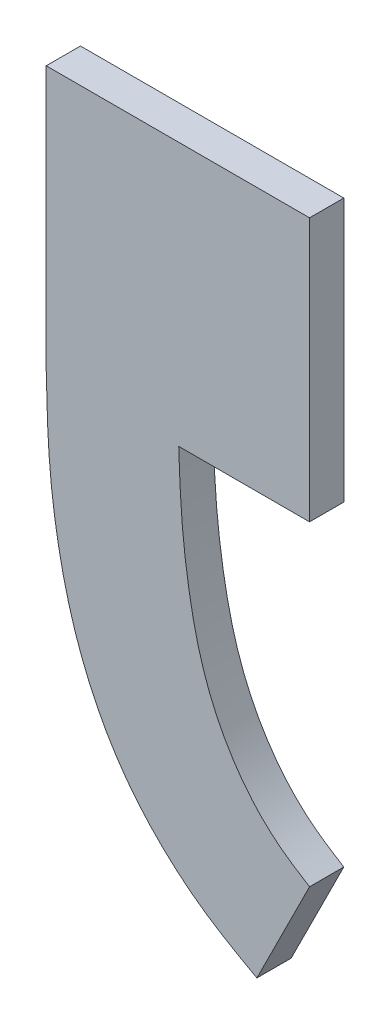
ISO-10303-21;
HEADER;
FILE_DESCRIPTION(('STEP AP214'),'2;1');
FILE_NAME('part.step','',(''),(''),'','','');
FILE_SCHEMA(('AUTOMOTIVE_DESIGN { 1 0 10303 214 1 1 1 1 }'));
ENDSEC;
DATA;
#1=APPLICATION_CONTEXT('core data for automotive mechanical design processes');
#2=APPLICATION_PROTOCOL_DEFINITION('international standard','automotive_design',2000,#1);
#3=PRODUCT_CONTEXT('',#1,'mechanical');
#4=PRODUCT('Part','Part','',(#3));
#5=PRODUCT_RELATED_PRODUCT_CATEGORY('part','',(#4));
#6=PRODUCT_DEFINITION_FORMATION('','',#4);
#7=PRODUCT_DEFINITION_CONTEXT('part definition',#1,'design');
#8=PRODUCT_DEFINITION('design','',#6,#7);
#9=PRODUCT_DEFINITION_SHAPE('','',#8);
#10=(LENGTH_UNIT() NAMED_UNIT(*) SI_UNIT(.MILLI.,.METRE.));
#11=(NAMED_UNIT(*) PLANE_ANGLE_UNIT() SI_UNIT($,.RADIAN.));
#12=(NAMED_UNIT(*) SI_UNIT($,.STERADIAN.) SOLID_ANGLE_UNIT());
#13=UNCERTAINTY_MEASURE_WITH_UNIT(LENGTH_MEASURE(1.E-05),#10,'distance_accuracy_value','');
#14=(GEOMETRIC_REPRESENTATION_CONTEXT(3) GLOBAL_UNCERTAINTY_ASSIGNED_CONTEXT((#13)) GLOBAL_UNIT_ASSIGNED_CONTEXT((#10,
#11,#12)) REPRESENTATION_CONTEXT('',''));
#15=CARTESIAN_POINT('',(0.,0.,0.));
#16=DIRECTION('',(0.,0.,1.));
#17=DIRECTION('',(1.,0.,0.));
#18=AXIS2_PLACEMENT_3D('',#15,#16,#17);
#19=CARTESIAN_POINT('',(0.0120192307692477,-15.,0.5));
#20=DIRECTION('',(0.,1.,0.));
#21=DIRECTION('',(0.,0.,1.));
#22=AXIS2_PLACEMENT_3D('',#19,#20,#21);
#23=PLANE('',#22);
#24=DIRECTION('',(1.,0.,0.));
#25=VECTOR('',#24,1.);
#26=CARTESIAN_POINT('',(0.0120192307692477,-15.,0.));
#27=LINE('',#26,#25);
#28=CARTESIAN_POINT('',(0.0120192307692477,-15.,0.));
#29=VERTEX_POINT('',#28);
#30=CARTESIAN_POINT('',(1.92307692307694,-15.,0.));
#31=VERTEX_POINT('',#30);
#32=EDGE_CURVE('E134',#29,#31,#27,.T.);
#33=ORIENTED_EDGE('',*,*,#32,.T.);
#34=DIRECTION('',(0.,0.,-1.));
#35=VECTOR('',#34,1.);
#36=CARTESIAN_POINT('',(1.92307692307694,-15.,0.5));
#37=LINE('',#36,#35);
#38=CARTESIAN_POINT('',(1.92307692307694,-15.,0.5));
#39=VERTEX_POINT('',#38);
#40=EDGE_CURVE('E11',#39,#31,#37,.T.);
#41=ORIENTED_EDGE('',*,*,#40,.F.);
#42=DIRECTION('',(1.,0.,0.));
#43=VECTOR('',#42,1.);
#44=CARTESIAN_POINT('',(0.0120192307692477,-15.,0.5));
#45=LINE('',#44,#43);
#46=CARTESIAN_POINT('',(0.0120192307692477,-15.,0.5));
#47=VERTEX_POINT('',#46);
#48=EDGE_CURVE('E194',#47,#39,#45,.T.);
#49=ORIENTED_EDGE('',*,*,#48,.F.);
#50=DIRECTION('',(0.,0.,-1.));
#51=VECTOR('',#50,1.);
#52=CARTESIAN_POINT('',(0.0120192307692477,-15.,0.5));
#53=LINE('',#52,#51);
#54=EDGE_CURVE('E124',#47,#29,#53,.T.);
#55=ORIENTED_EDGE('',*,*,#54,.T.);
#56=EDGE_LOOP('',(#33,#41,#49,#55));
#57=FACE_BOUND('',#56,.T.);
#58=ADVANCED_FACE('F39',(#57),#23,.F.);
#59=CARTESIAN_POINT('',(1.92307692307694,-15.,0.5));
#60=DIRECTION('',(-1.,0.,0.));
#61=DIRECTION('',(0.,0.,1.));
#62=AXIS2_PLACEMENT_3D('',#59,#60,#61);
#63=PLANE('',#62);
#64=DIRECTION('',(0.,1.,0.));
#65=VECTOR('',#64,1.);
#66=CARTESIAN_POINT('',(1.92307692307694,-15.,0.));
#67=LINE('',#66,#65);
#68=CARTESIAN_POINT('',(1.92307692307694,-11.1538461538462,0.));
#69=VERTEX_POINT('',#68);
#70=EDGE_CURVE('E163',#31,#69,#67,.T.);
#71=ORIENTED_EDGE('',*,*,#70,.T.);
#72=DIRECTION('',(0.,0.,-1.));
#73=VECTOR('',#72,1.);
#74=CARTESIAN_POINT('',(1.92307692307694,-11.1538461538462,0.5));
#75=LINE('',#74,#73);
#76=CARTESIAN_POINT('',(1.92307692307694,-11.1538461538462,0.5));
#77=VERTEX_POINT('',#76);
#78=EDGE_CURVE('E50',#77,#69,#75,.T.);
#79=ORIENTED_EDGE('',*,*,#78,.F.);
#80=DIRECTION('',(0.,1.,0.));
#81=VECTOR('',#80,1.);
#82=CARTESIAN_POINT('',(1.92307692307694,-15.,0.5));
#83=LINE('',#82,#81);
#84=EDGE_CURVE('E94',#39,#77,#83,.T.);
#85=ORIENTED_EDGE('',*,*,#84,.F.);
#86=ORIENTED_EDGE('',*,*,#40,.T.);
#87=EDGE_LOOP('',(#71,#79,#85,#86));
#88=FACE_BOUND('',#87,.T.);
#89=ADVANCED_FACE('F160',(#88),#63,.F.);
#90=CARTESIAN_POINT('',(1.92307692307694,-11.1538461538462,0.5));
#91=DIRECTION('',(0.,-1.,0.));
#92=DIRECTION('',(0.,0.,-1.));
#93=AXIS2_PLACEMENT_3D('',#90,#91,#92);
#94=PLANE('',#93);
#95=DIRECTION('',(-1.,0.,0.));
#96=VECTOR('',#95,1.);
#97=CARTESIAN_POINT('',(1.92307692307694,-11.1538461538462,0.));
#98=LINE('',#97,#96);
#99=CARTESIAN_POINT('',(-1.92307692307691,-11.1538461538462,0.));
#100=VERTEX_POINT('',#99);
#101=EDGE_CURVE('E171',#69,#100,#98,.T.);
#102=ORIENTED_EDGE('',*,*,#101,.T.);
#103=DIRECTION('',(0.,0.,-1.));
#104=VECTOR('',#103,1.);
#105=CARTESIAN_POINT('',(-1.92307692307691,-11.1538461538462,0.5));
#106=LINE('',#105,#104);
#107=CARTESIAN_POINT('',(-1.92307692307691,-11.1538461538462,0.5));
#108=VERTEX_POINT('',#107);
#109=EDGE_CURVE('E180',#108,#100,#106,.T.);
#110=ORIENTED_EDGE('',*,*,#109,.F.);
#111=DIRECTION('',(-1.,0.,0.));
#112=VECTOR('',#111,1.);
#113=CARTESIAN_POINT('',(1.92307692307694,-11.1538461538462,0.5));
#114=LINE('',#113,#112);
#115=EDGE_CURVE('E176',#77,#108,#114,.T.);
#116=ORIENTED_EDGE('',*,*,#115,.F.);
#117=ORIENTED_EDGE('',*,*,#78,.T.);
#118=EDGE_LOOP('',(#102,#110,#116,#117));
#119=FACE_BOUND('',#118,.T.);
#120=ADVANCED_FACE('F151',(#119),#94,.F.);
#121=CARTESIAN_POINT('',(-1.92307692307691,-11.1538461538462,0.5));
#122=DIRECTION('',(1.,0.,0.));
#123=DIRECTION('',(0.,0.,-1.));
#124=AXIS2_PLACEMENT_3D('',#121,#122,#123);
#125=PLANE('',#124);
#126=DIRECTION('',(0.,-1.,0.));
#127=VECTOR('',#126,1.);
#128=CARTESIAN_POINT('',(-1.92307692307691,-11.1538461538462,0.));
#129=LINE('',#128,#127);
#130=CARTESIAN_POINT('',(-1.92307692307691,-15.,0.));
#131=VERTEX_POINT('',#130);
#132=EDGE_CURVE('E177',#100,#131,#129,.T.);
#133=ORIENTED_EDGE('',*,*,#132,.T.);
#134=DIRECTION('',(0.,0.,-1.));
#135=VECTOR('',#134,1.);
#136=CARTESIAN_POINT('',(-1.92307692307691,-15.,0.5));
#137=LINE('',#136,#135);
#138=CARTESIAN_POINT('',(-1.92307692307691,-15.,0.5));
#139=VERTEX_POINT('',#138);
#140=EDGE_CURVE('E118',#139,#131,#137,.T.);
#141=ORIENTED_EDGE('',*,*,#140,.F.);
#142=DIRECTION('',(0.,-1.,0.));
#143=VECTOR('',#142,1.);
#144=CARTESIAN_POINT('',(-1.92307692307691,-11.1538461538462,0.5));
#145=LINE('',#144,#143);
#146=EDGE_CURVE('E112',#108,#139,#145,.T.);
#147=ORIENTED_EDGE('',*,*,#146,.F.);
#148=ORIENTED_EDGE('',*,*,#109,.T.);
#149=EDGE_LOOP('',(#133,#141,#147,#148));
#150=FACE_BOUND('',#149,.T.);
#151=ADVANCED_FACE('F152',(#150),#125,.F.);
#152=CARTESIAN_POINT('',(-1.92307692307691,-15.,0.5));
#153=CARTESIAN_POINT('',(-1.91433657056015,-15.3810767358832,0.5));
#154=CARTESIAN_POINT('',(-1.89766609116232,-16.1079046140902,0.5));
#155=CARTESIAN_POINT('',(-1.76020005937377,-17.1394582093312,0.5));
#156=CARTESIAN_POINT('',(-1.536476701543,-18.0601395414614,0.5));
#157=CARTESIAN_POINT('',(-1.21069108944097,-18.8711982332195,0.5));
#158=CARTESIAN_POINT('',(-0.785119946019379,-19.5855678421094,0.5));
#159=CARTESIAN_POINT('',(-0.242975559569955,-20.2021133103051,0.5));
#160=CARTESIAN_POINT('',(0.40399486861272,-20.737784557651,0.5));
#161=CARTESIAN_POINT('',(0.900466251360351,-21.0132560811903,0.5));
#162=CARTESIAN_POINT('',(1.15384615384617,-21.1538461538462,0.5));
#163=B_SPLINE_CURVE_WITH_KNOTS('',3,(#152,#153,#154,#155,#156,#157,#158,#159,#160,#161,#162),
.UNSPECIFIED.,.F.,.F.,(4,1,1,1,1,1,1,1,4),(0.,0.156601585827271,0.298686294997552,
0.426910206074715,0.545117488967752,0.656687364828344,0.767001116976198,0.881086329823996,1.),.UNSPECIFIED.);
#164=DIRECTION('',(0.,0.,-1.));
#165=VECTOR('',#164,1.);
#166=SURFACE_OF_LINEAR_EXTRUSION('',#163,#165);
#167=CARTESIAN_POINT('',(-1.92307692307691,-15.,0.));
#168=CARTESIAN_POINT('',(-1.91433657056015,-15.3810767358832,0.));
#169=CARTESIAN_POINT('',(-1.89766609116232,-16.1079046140902,0.));
#170=CARTESIAN_POINT('',(-1.76020005937377,-17.1394582093312,0.));
#171=CARTESIAN_POINT('',(-1.536476701543,-18.0601395414614,0.));
#172=CARTESIAN_POINT('',(-1.21069108944097,-18.8711982332195,0.));
#173=CARTESIAN_POINT('',(-0.785119946019379,-19.5855678421094,0.));
#174=CARTESIAN_POINT('',(-0.242975559569955,-20.2021133103051,0.));
#175=CARTESIAN_POINT('',(0.40399486861272,-20.737784557651,0.));
#176=CARTESIAN_POINT('',(0.900466251360351,-21.0132560811903,0.));
#177=CARTESIAN_POINT('',(1.15384615384617,-21.1538461538462,0.));
#178=B_SPLINE_CURVE_WITH_KNOTS('',3,(#167,#168,#169,#170,#171,#172,#173,#174,#175,#176,#177),
.UNSPECIFIED.,.F.,.F.,(4,1,1,1,1,1,1,1,4),(0.,0.156601585827271,0.298686294997552,
0.426910206074715,0.545117488967752,0.656687364828344,0.767001116976198,0.881086329823996,1.),.UNSPECIFIED.);
#179=CARTESIAN_POINT('',(1.15384615384617,-21.1538461538462,0.));
#180=VERTEX_POINT('',#179);
#181=EDGE_CURVE('E116',#131,#180,#178,.T.);
#182=ORIENTED_EDGE('',*,*,#181,.T.);
#183=DIRECTION('',(0.,0.,-1.));
#184=VECTOR('',#183,1.);
#185=CARTESIAN_POINT('',(1.15384615384617,-21.1538461538462,0.5));
#186=LINE('',#185,#184);
#187=CARTESIAN_POINT('',(1.15384615384617,-21.1538461538462,0.5));
#188=VERTEX_POINT('',#187);
#189=EDGE_CURVE('E117',#188,#180,#186,.T.);
#190=ORIENTED_EDGE('',*,*,#189,.F.);
#191=EDGE_CURVE('E103',#139,#188,#163,.T.);
#192=ORIENTED_EDGE('',*,*,#191,.F.);
#193=ORIENTED_EDGE('',*,*,#140,.T.);
#194=EDGE_LOOP('',(#182,#190,#192,#193));
#195=FACE_BOUND('',#194,.T.);
#196=ADVANCED_FACE('F119',(#195),#166,.F.);
#197=CARTESIAN_POINT('',(1.15384615384617,-21.1538461538462,0.5));
#198=DIRECTION('',(-0.894427190999916,0.447213595499958,0.));
#199=DIRECTION('',(-0.447213595499958,-0.894427190999916,0.));
#200=AXIS2_PLACEMENT_3D('',#197,#198,#199);
#201=PLANE('',#200);
#202=DIRECTION('',(0.447213595499958,0.894427190999916,0.));
#203=VECTOR('',#202,1.);
#204=CARTESIAN_POINT('',(1.15384615384617,-21.1538461538462,0.));
#205=LINE('',#204,#203);
#206=CARTESIAN_POINT('',(1.92307692307694,-19.6153846153846,0.));
#207=VERTEX_POINT('',#206);
#208=EDGE_CURVE('E83',#180,#207,#205,.T.);
#209=ORIENTED_EDGE('',*,*,#208,.T.);
#210=DIRECTION('',(0.,0.,-1.));
#211=VECTOR('',#210,1.);
#212=CARTESIAN_POINT('',(1.92307692307694,-19.6153846153846,0.5));
#213=LINE('',#212,#211);
#214=CARTESIAN_POINT('',(1.92307692307694,-19.6153846153846,0.5));
#215=VERTEX_POINT('',#214);
#216=EDGE_CURVE('E123',#215,#207,#213,.T.);
#217=ORIENTED_EDGE('',*,*,#216,.F.);
#218=DIRECTION('',(0.447213595499958,0.894427190999916,0.));
#219=VECTOR('',#218,1.);
#220=CARTESIAN_POINT('',(1.15384615384617,-21.1538461538462,0.5));
#221=LINE('',#220,#219);
#222=EDGE_CURVE('E106',#188,#215,#221,.T.);
#223=ORIENTED_EDGE('',*,*,#222,.F.);
#224=ORIENTED_EDGE('',*,*,#189,.T.);
#225=EDGE_LOOP('',(#209,#217,#223,#224));
#226=FACE_BOUND('',#225,.T.);
#227=ADVANCED_FACE('F121',(#226),#201,.F.);
#228=CARTESIAN_POINT('',(1.92307692307694,-19.6153846153846,0.5));
#229=CARTESIAN_POINT('',(1.77113809650168,-19.5202345564834,0.5));
#230=CARTESIAN_POINT('',(1.46878250241927,-19.3308876118314,0.5));
#231=CARTESIAN_POINT('',(1.0804243240048,-18.9568251895871,0.5));
#232=CARTESIAN_POINT('',(0.760410940366441,-18.517308434697,0.5));
#233=CARTESIAN_POINT('',(0.495090367822198,-18.0099272751774,0.5));
#234=CARTESIAN_POINT('',(0.290092377329316,-17.4127986509036,0.5));
#235=CARTESIAN_POINT('',(0.146567444426938,-16.7079392684701,0.5));
#236=CARTESIAN_POINT('',(0.0444548234273604,-15.8921756964286,0.5));
#237=CARTESIAN_POINT('',(0.0232473161701429,-15.3088405079473,0.5));
#238=CARTESIAN_POINT('',(0.0120192307692477,-15.,0.5));
#239=B_SPLINE_CURVE_WITH_KNOTS('',3,(#228,#229,#230,#231,#232,#233,#234,#235,#236,#237,#238),
.UNSPECIFIED.,.F.,.F.,(4,1,1,1,1,1,1,1,4),(0.,0.102367245238738,0.20370901859906,
0.30618529824539,0.412314489693373,0.530130196862162,0.666144691715152,0.823243917000724,1.),.UNSPECIFIED.);
#240=DIRECTION('',(0.,0.,-1.));
#241=VECTOR('',#240,1.);
#242=SURFACE_OF_LINEAR_EXTRUSION('',#239,#241);
#243=CARTESIAN_POINT('',(1.92307692307694,-19.6153846153846,0.));
#244=CARTESIAN_POINT('',(1.77113809650168,-19.5202345564834,0.));
#245=CARTESIAN_POINT('',(1.46878250241927,-19.3308876118314,0.));
#246=CARTESIAN_POINT('',(1.0804243240048,-18.9568251895871,0.));
#247=CARTESIAN_POINT('',(0.760410940366441,-18.517308434697,0.));
#248=CARTESIAN_POINT('',(0.495090367822198,-18.0099272751774,0.));
#249=CARTESIAN_POINT('',(0.290092377329316,-17.4127986509036,0.));
#250=CARTESIAN_POINT('',(0.146567444426938,-16.7079392684701,0.));
#251=CARTESIAN_POINT('',(0.0444548234273604,-15.8921756964286,0.));
#252=CARTESIAN_POINT('',(0.0232473161701429,-15.3088405079473,0.));
#253=CARTESIAN_POINT('',(0.0120192307692477,-15.,0.));
#254=B_SPLINE_CURVE_WITH_KNOTS('',3,(#243,#244,#245,#246,#247,#248,#249,#250,#251,#252,#253),
.UNSPECIFIED.,.F.,.F.,(4,1,1,1,1,1,1,1,4),(0.,0.102367245238738,0.20370901859906,
0.30618529824539,0.412314489693373,0.530130196862162,0.666144691715152,0.823243917000724,1.),.UNSPECIFIED.);
#255=EDGE_CURVE('E90',#207,#29,#254,.T.);
#256=ORIENTED_EDGE('',*,*,#255,.T.);
#257=ORIENTED_EDGE('',*,*,#54,.F.);
#258=EDGE_CURVE('E54',#215,#47,#239,.T.);
#259=ORIENTED_EDGE('',*,*,#258,.F.);
#260=ORIENTED_EDGE('',*,*,#216,.T.);
#261=EDGE_LOOP('',(#256,#257,#259,#260));
#262=FACE_BOUND('',#261,.T.);
#263=ADVANCED_FACE('F141',(#262),#242,.F.);
#264=CARTESIAN_POINT('',(-1.32186310897958,-18.5768912093183,0.5));
#265=DIRECTION('',(0.,0.,-1.));
#266=DIRECTION('',(-1.,0.,0.));
#267=AXIS2_PLACEMENT_3D('',#264,#265,#266);
#268=PLANE('',#267);
#269=ORIENTED_EDGE('',*,*,#48,.T.);
#270=ORIENTED_EDGE('',*,*,#84,.T.);
#271=ORIENTED_EDGE('',*,*,#115,.T.);
#272=ORIENTED_EDGE('',*,*,#146,.T.);
#273=ORIENTED_EDGE('',*,*,#191,.T.);
#274=ORIENTED_EDGE('',*,*,#222,.T.);
#275=ORIENTED_EDGE('',*,*,#258,.T.);
#276=EDGE_LOOP('',(#269,#270,#271,#272,#273,#274,#275));
#277=FACE_BOUND('',#276,.T.);
#278=ADVANCED_FACE('F109',(#277),#268,.F.);
#279=CARTESIAN_POINT('',(-1.32186310897958,-18.5768912093183,0.));
#280=DIRECTION('',(0.,0.,-1.));
#281=DIRECTION('',(-1.,0.,0.));
#282=AXIS2_PLACEMENT_3D('',#279,#280,#281);
#283=PLANE('',#282);
#284=ORIENTED_EDGE('',*,*,#32,.F.);
#285=ORIENTED_EDGE('',*,*,#255,.F.);
#286=ORIENTED_EDGE('',*,*,#208,.F.);
#287=ORIENTED_EDGE('',*,*,#181,.F.);
#288=ORIENTED_EDGE('',*,*,#132,.F.);
#289=ORIENTED_EDGE('',*,*,#101,.F.);
#290=ORIENTED_EDGE('',*,*,#70,.F.);
#291=EDGE_LOOP('',(#284,#285,#286,#287,#288,#289,#290));
#292=FACE_BOUND('',#291,.T.);
#293=ADVANCED_FACE('F144',(#292),#283,.T.);
#294=CLOSED_SHELL('',(#58,#89,#120,#151,#196,#227,#263,#278,#293));
#295=MANIFOLD_SOLID_BREP('B2',#294);
#296=ADVANCED_BREP_SHAPE_REPRESENTATION('',(#18,#295),#14);
#297=SHAPE_DEFINITION_REPRESENTATION(#9,#296);
ENDSEC;
END-ISO-10303-21;
